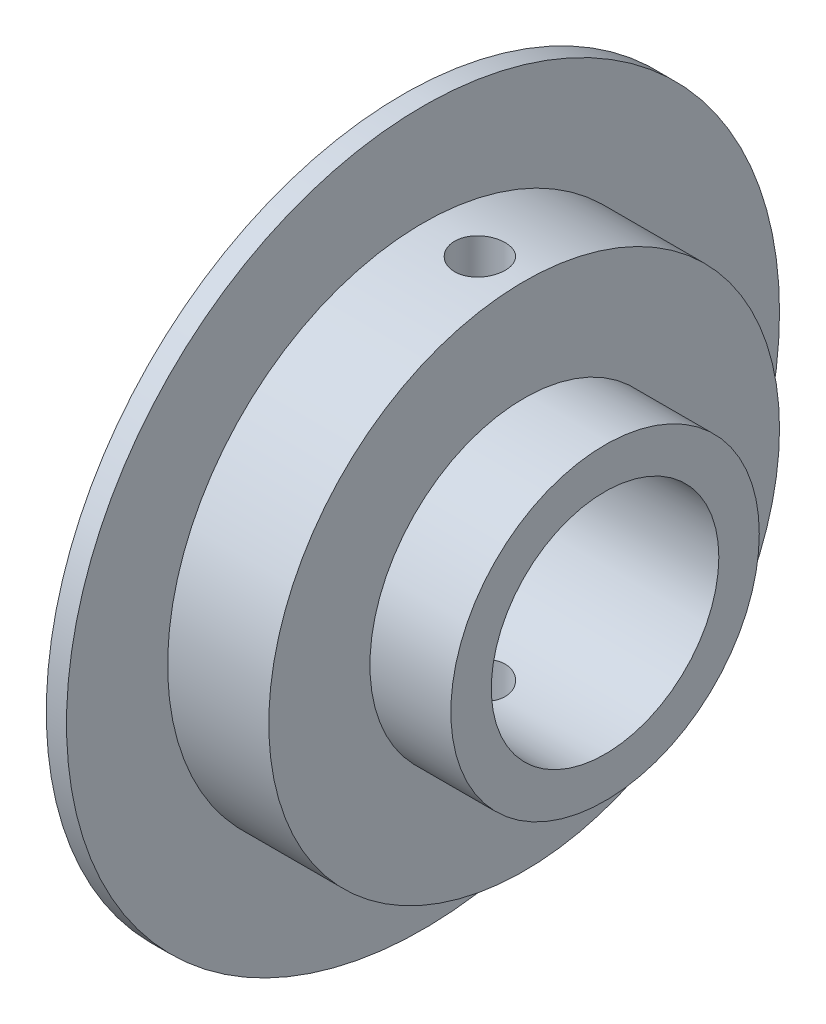
ISO-10303-21;
HEADER;
FILE_DESCRIPTION(('STEP AP214'),'2;1');
FILE_NAME('part.step','',(''),(''),'','','');
FILE_SCHEMA(('AUTOMOTIVE_DESIGN { 1 0 10303 214 1 1 1 1 }'));
ENDSEC;
DATA;
#1=APPLICATION_CONTEXT('core data for automotive mechanical design processes');
#2=APPLICATION_PROTOCOL_DEFINITION('international standard','automotive_design',2000,#1);
#3=PRODUCT_CONTEXT('',#1,'mechanical');
#4=PRODUCT('Part','Part','',(#3));
#5=PRODUCT_RELATED_PRODUCT_CATEGORY('part','',(#4));
#6=PRODUCT_DEFINITION_FORMATION('','',#4);
#7=PRODUCT_DEFINITION_CONTEXT('part definition',#1,'design');
#8=PRODUCT_DEFINITION('design','',#6,#7);
#9=PRODUCT_DEFINITION_SHAPE('','',#8);
#10=(LENGTH_UNIT() NAMED_UNIT(*) SI_UNIT(.MILLI.,.METRE.));
#11=(NAMED_UNIT(*) PLANE_ANGLE_UNIT() SI_UNIT($,.RADIAN.));
#12=(NAMED_UNIT(*) SI_UNIT($,.STERADIAN.) SOLID_ANGLE_UNIT());
#13=UNCERTAINTY_MEASURE_WITH_UNIT(LENGTH_MEASURE(1.E-05),#10,'distance_accuracy_value','');
#14=(GEOMETRIC_REPRESENTATION_CONTEXT(3) GLOBAL_UNCERTAINTY_ASSIGNED_CONTEXT((#13)) GLOBAL_UNIT_ASSIGNED_CONTEXT((#10,
#11,#12)) REPRESENTATION_CONTEXT('',''));
#15=CARTESIAN_POINT('',(0.,0.,0.));
#16=DIRECTION('',(0.,0.,1.));
#17=DIRECTION('',(1.,0.,0.));
#18=AXIS2_PLACEMENT_3D('',#15,#16,#17);
#19=CARTESIAN_POINT('',(0.,9.6,0.));
#20=DIRECTION('',(-1.,0.,0.));
#21=DIRECTION('',(0.,0.,1.));
#22=AXIS2_PLACEMENT_3D('',#19,#20,#21);
#23=PLANE('',#22);
#24=CARTESIAN_POINT('',(0.,-4.5,0.));
#25=DIRECTION('',(1.,0.,0.));
#26=DIRECTION('',(0.,0.,-1.));
#27=AXIS2_PLACEMENT_3D('',#24,#25,#26);
#28=CIRCLE('',#27,4.5);
#29=CARTESIAN_POINT('',(0.,-4.5,-4.5));
#30=VERTEX_POINT('',#29);
#31=EDGE_CURVE('E10',#30,#30,#28,.T.);
#32=ORIENTED_EDGE('',*,*,#31,.T.);
#33=EDGE_LOOP('',(#32));
#34=FACE_BOUND('',#33,.T.);
#35=CARTESIAN_POINT('',(0.,-4.5,0.));
#36=DIRECTION('',(1.,0.,0.));
#37=DIRECTION('',(0.,0.,-1.));
#38=AXIS2_PLACEMENT_3D('',#35,#36,#37);
#39=CIRCLE('',#38,14.1);
#40=CARTESIAN_POINT('',(0.,-4.5,-14.1));
#41=VERTEX_POINT('',#40);
#42=EDGE_CURVE('E121',#41,#41,#39,.T.);
#43=ORIENTED_EDGE('',*,*,#42,.F.);
#44=EDGE_LOOP('',(#43));
#45=FACE_BOUND('',#44,.T.);
#46=ADVANCED_FACE('F37',(#34,#45),#23,.T.);
#47=CARTESIAN_POINT('',(124.631559107303,-4.5,0.));
#48=DIRECTION('',(1.,0.,0.));
#49=DIRECTION('',(0.,0.,-1.));
#50=AXIS2_PLACEMENT_3D('',#47,#48,#49);
#51=CYLINDRICAL_SURFACE('',#50,4.5);
#52=CARTESIAN_POINT('',(3.05,-8.88748219369606,1.));
#53=CARTESIAN_POINT('',(3.10542118384673,-8.88748331342391,0.999998124740785));
#54=CARTESIAN_POINT('',(3.16086470629648,-8.88854372765849,0.995377065735324));
#55=CARTESIAN_POINT('',(3.2701734130143,-8.89266269613714,0.97703611833839));
#56=CARTESIAN_POINT('',(3.324037451702,-8.89572266492455,0.963309788508038));
#57=CARTESIAN_POINT('',(3.42859021114545,-8.90347746164852,0.927213191558881));
#58=CARTESIAN_POINT('',(3.47928240700305,-8.90817046205988,0.904852584002374));
#59=CARTESIAN_POINT('',(3.57619750352572,-8.91866033160417,0.852150017177229));
#60=CARTESIAN_POINT('',(3.6224204658707,-8.92445718549953,0.821808168079243));
#61=CARTESIAN_POINT('',(3.70989128568498,-8.93661451639959,0.753440537295431));
#62=CARTESIAN_POINT('',(3.75104988106007,-8.94298239912488,0.715301848896048));
#63=CARTESIAN_POINT('',(3.82644137621931,-8.95549951724043,0.632666839431873));
#64=CARTESIAN_POINT('',(3.86067372682177,-8.96164873526093,0.588170014707602));
#65=CARTESIAN_POINT('',(3.92159537569772,-8.97311646400736,0.493481972618768));
#66=CARTESIAN_POINT('',(3.94819862472658,-8.97842521703683,0.443234108266534));
#67=CARTESIAN_POINT('',(3.99254990086023,-8.98753012167776,0.338843167825976));
#68=CARTESIAN_POINT('',(4.0102989542355,-8.99132644858096,0.284700544003477));
#69=CARTESIAN_POINT('',(4.03615671646943,-8.99692642233617,0.174985398164166));
#70=CARTESIAN_POINT('',(4.0444165546002,-8.99876127463464,0.11945011413096));
#71=CARTESIAN_POINT('',(4.05153413543621,-9.00033974476021,0.00775382889301148));
#72=CARTESIAN_POINT('',(4.05039298696691,-9.00008360921472,-0.0484070977382728));
#73=CARTESIAN_POINT('',(4.03885313875198,-8.9975327467564,-0.158717960467174));
#74=CARTESIAN_POINT('',(4.02861736045445,-8.99527389802337,-0.212885892163576));
#75=CARTESIAN_POINT('',(3.99943866622242,-8.98901238651153,-0.318715422771708));
#76=CARTESIAN_POINT('',(3.98049534837337,-8.98500964324008,-0.370376905871404));
#77=CARTESIAN_POINT('',(3.93429651294953,-8.97565269302828,-0.470176884695466));
#78=CARTESIAN_POINT('',(3.90697964172778,-8.97028856276396,-0.518286010447011));
#79=CARTESIAN_POINT('',(3.8448549530255,-8.95879635842009,-0.609296568272403));
#80=CARTESIAN_POINT('',(3.81004608446502,-8.9526681771998,-0.652197268314768));
#81=CARTESIAN_POINT('',(3.73303990307352,-8.94016582863413,-0.732542494790414));
#82=CARTESIAN_POINT('',(3.69070001201457,-8.93378920480069,-0.769850109238106));
#83=CARTESIAN_POINT('',(3.60029862619146,-8.92163160720916,-0.836861515102731));
#84=CARTESIAN_POINT('',(3.55223696611286,-8.91585065067021,-0.866565086744066));
#85=CARTESIAN_POINT('',(3.45153005582566,-8.90553216782544,-0.91758882957986));
#86=CARTESIAN_POINT('',(3.39887088859767,-8.9009986024148,-0.93888238720365));
#87=CARTESIAN_POINT('',(3.29059691435886,-8.89374257045182,-0.97227634761584));
#88=CARTESIAN_POINT('',(3.23498259457134,-8.89101980634257,-0.984378260852373));
#89=CARTESIAN_POINT('',(3.12363000647013,-8.88775454247314,-0.998831494501015));
#90=CARTESIAN_POINT('',(3.06791893448007,-8.88716740125429,-1.00138249383898));
#91=CARTESIAN_POINT('',(2.95686753851872,-8.88811932262746,-0.997202737121733));
#92=CARTESIAN_POINT('',(2.90152718847078,-8.88965823406047,-0.990472640937895));
#93=CARTESIAN_POINT('',(2.79348823125171,-8.89464664137563,-0.968095186613481));
#94=CARTESIAN_POINT('',(2.74076551235185,-8.89807241834516,-0.952558463272168));
#95=CARTESIAN_POINT('',(2.63867168443566,-8.90642704252923,-0.913128875693618));
#96=CARTESIAN_POINT('',(2.58930090525027,-8.91135603739913,-0.889235190550063));
#97=CARTESIAN_POINT('',(2.49445019911179,-8.92225937025824,-0.833332350832739));
#98=CARTESIAN_POINT('',(2.44904434250747,-8.92824903821989,-0.801200572354219));
#99=CARTESIAN_POINT('',(2.36419582129565,-8.94055871006593,-0.729893521468861));
#100=CARTESIAN_POINT('',(2.32475392348571,-8.94687875628735,-0.690717344765467));
#101=CARTESIAN_POINT('',(2.2521743282457,-8.95928466963624,-0.605528607307309));
#102=CARTESIAN_POINT('',(2.21917298206527,-8.96536366365756,-0.559398704918137));
#103=CARTESIAN_POINT('',(2.16138793288299,-8.97647455721721,-0.462134081071293));
#104=CARTESIAN_POINT('',(2.13660383968328,-8.98150650647044,-0.41099959740653));
#105=CARTESIAN_POINT('',(2.09614494268329,-8.98992744359791,-0.305500950001647));
#106=CARTESIAN_POINT('',(2.08041140205292,-8.99332700109296,-0.251160194087202));
#107=CARTESIAN_POINT('',(2.05831741999173,-8.99814588349754,-0.140522543397795));
#108=CARTESIAN_POINT('',(2.05195556964307,-8.99956550606412,-0.0842259439625955));
#109=CARTESIAN_POINT('',(2.04885060881552,-9.00025537600146,0.0274324227701897));
#110=CARTESIAN_POINT('',(2.05190418467038,-8.99957105615266,0.0827883528681097));
#111=CARTESIAN_POINT('',(2.06708747527836,-8.99622763231539,0.192177020683066));
#112=CARTESIAN_POINT('',(2.07921701654745,-8.99356856607352,0.246209783671608));
#113=CARTESIAN_POINT('',(2.11210917859742,-8.98657818532304,0.351255142393358));
#114=CARTESIAN_POINT('',(2.13284211195059,-8.98225262496609,0.402277441320411));
#115=CARTESIAN_POINT('',(2.18232390176949,-8.97239043658606,0.500145764046379));
#116=CARTESIAN_POINT('',(2.21107356308923,-8.96685368697546,0.546991367894834));
#117=CARTESIAN_POINT('',(2.27643113873243,-8.95503741308905,0.636165449755516));
#118=CARTESIAN_POINT('',(2.31318151784809,-8.94874549747429,0.678387879198454));
#119=CARTESIAN_POINT('',(2.3932110682228,-8.93619353584561,0.756135866174557));
#120=CARTESIAN_POINT('',(2.43649181788245,-8.92993349791575,0.791659799988316));
#121=CARTESIAN_POINT('',(2.52907724990507,-8.9180568509948,0.855479255716282));
#122=CARTESIAN_POINT('',(2.57845730841477,-8.91245039614391,0.883667429316083));
#123=CARTESIAN_POINT('',(2.68136844773064,-8.902644201522,0.931300131649453));
#124=CARTESIAN_POINT('',(2.73489602206519,-8.8984432890926,0.950751953872793));
#125=CARTESIAN_POINT('',(2.83205323701998,-8.89268810860696,0.976946747324326));
#126=CARTESIAN_POINT('',(2.87516171363364,-8.8907490225869,0.985574910239044));
#127=CARTESIAN_POINT('',(2.96217547829319,-8.88814565456081,0.997102130853923));
#128=CARTESIAN_POINT('',(3.00608072483999,-8.88748130635241,1.00000148607481));
#129=CARTESIAN_POINT('',(3.05,-8.88748219369606,1.));
#130=B_SPLINE_CURVE_WITH_KNOTS('',3,(#52,#53,#54,#55,#56,#57,#58,#59,#60,#61,#62,#63,#64,#65,
#66,#67,#68,#69,#70,#71,#72,#73,#74,#75,#76,#77,#78,#79,#80,#81,#82,#83,#84,#85,#86,#87,#88,#89,
#90,#91,#92,#93,#94,#95,#96,#97,#98,#99,#100,#101,#102,#103,#104,#105,#106,#107,#108,#109,#110,
#111,#112,#113,#114,#115,#116,#117,#118,#119,#120,#121,#122,#123,#124,#125,#126,#127,#128,#129),
.UNSPECIFIED.,.T.,.F.,(4,2,2,2,2,2,2,2,2,2,2,2,2,2,2,2,2,2,2,2,2,2,2,2,2,2,2,2,2,2,2,2,2,2,2,2,
2,2,4),(0.,0.16610255849459,0.332322750192435,0.498357520008392,0.664389998050726,
0.833022969567701,1.00166930675099,1.17214906318353,1.34260905508582,1.51031485736443,
1.67800087939989,1.84274220917405,2.00749114368964,2.17347729000196,2.33948673831992,
2.50906023645939,2.67863863513816,2.84874944722111,3.01883229921634,3.18533874755265,
3.35183335815117,3.51628128972295,3.68074537959259,3.84781614360498,4.01490836999235,
4.18522523018715,4.35553400169376,4.52472464724766,4.6938898544815,4.85942793779578,
5.02496285698629,5.18993125886616,5.35491622901636,5.52312234724343,5.69136918646788,
5.86195485764065,6.03239785047427,6.16403493145229,6.29566517579135),.UNSPECIFIED.);
#131=CARTESIAN_POINT('',(3.05,-8.88748219369606,1.));
#132=VERTEX_POINT('',#131);
#133=EDGE_CURVE('E87',#132,#132,#130,.T.);
#134=ORIENTED_EDGE('',*,*,#133,.F.);
#135=EDGE_LOOP('',(#134));
#136=FACE_BOUND('',#135,.T.);
#137=CARTESIAN_POINT('',(3.05,-0.11251780630394,1.));
#138=CARTESIAN_POINT('',(2.99457881615327,-0.112516686576091,0.999998124740785));
#139=CARTESIAN_POINT('',(2.93913529370352,-0.111456272341509,0.995377065735324));
#140=CARTESIAN_POINT('',(2.8298265869857,-0.107337303862863,0.97703611833839));
#141=CARTESIAN_POINT('',(2.77596254829799,-0.104277335075449,0.963309788508038));
#142=CARTESIAN_POINT('',(2.67140978885454,-0.0965225383514754,0.927213191558881));
#143=CARTESIAN_POINT('',(2.62071759299695,-0.091829537940117,0.904852584002374));
#144=CARTESIAN_POINT('',(2.52380249647428,-0.0813396683958286,0.85215001717723));
#145=CARTESIAN_POINT('',(2.4775795341293,-0.0755428145004641,0.821808168079243));
#146=CARTESIAN_POINT('',(2.39010871431502,-0.0633854836004084,0.753440537295431));
#147=CARTESIAN_POINT('',(2.34895011893993,-0.0570176008751201,0.715301848896049));
#148=CARTESIAN_POINT('',(2.27355862378069,-0.044500482759573,0.632666839431874));
#149=CARTESIAN_POINT('',(2.23932627317823,-0.0383512647390676,0.588170014707603));
#150=CARTESIAN_POINT('',(2.17840462430228,-0.0268835359926352,0.49348197261877));
#151=CARTESIAN_POINT('',(2.15180137527342,-0.0215747829631692,0.443234108266535));
#152=CARTESIAN_POINT('',(2.10745009913977,-0.0124698783222363,0.338843167825977));
#153=CARTESIAN_POINT('',(2.0897010457645,-0.00867355141903606,0.284700544003479));
#154=CARTESIAN_POINT('',(2.06384328353057,-0.00307357766382575,0.174985398164168));
#155=CARTESIAN_POINT('',(2.0555834453998,-0.00123872536536133,0.119450114130962));
#156=CARTESIAN_POINT('',(2.04846586456379,0.000339744760214479,0.00775382889301297));
#157=CARTESIAN_POINT('',(2.04960701303309,8.36092147237012E-05,-0.0484070977382713));
#158=CARTESIAN_POINT('',(2.06114686124802,-0.00246725324360091,-0.158717960467172));
#159=CARTESIAN_POINT('',(2.07138263954555,-0.00472610197662878,-0.212885892163575));
#160=CARTESIAN_POINT('',(2.10056133377758,-0.0109876134884737,-0.318715422771707));
#161=CARTESIAN_POINT('',(2.11950465162663,-0.0149903567599151,-0.370376905871404));
#162=CARTESIAN_POINT('',(2.16570348705047,-0.0243473069717237,-0.470176884695465));
#163=CARTESIAN_POINT('',(2.19302035827222,-0.0297114372360362,-0.51828601044701));
#164=CARTESIAN_POINT('',(2.2551450469745,-0.0412036415799141,-0.609296568272403));
#165=CARTESIAN_POINT('',(2.28995391553498,-0.0473318228002018,-0.652197268314768));
#166=CARTESIAN_POINT('',(2.36696009692648,-0.0598341713658731,-0.732542494790414));
#167=CARTESIAN_POINT('',(2.40929998798542,-0.0662107951993092,-0.769850109238106));
#168=CARTESIAN_POINT('',(2.49970137380854,-0.0783683927908374,-0.836861515102731));
#169=CARTESIAN_POINT('',(2.54776303388714,-0.0841493493297904,-0.866565086744066));
#170=CARTESIAN_POINT('',(2.64846994417434,-0.0944678321745574,-0.91758882957986));
#171=CARTESIAN_POINT('',(2.70112911140233,-0.0990013975851999,-0.93888238720365));
#172=CARTESIAN_POINT('',(2.80940308564114,-0.10625742954818,-0.972276347615841));
#173=CARTESIAN_POINT('',(2.86501740542866,-0.108980193657431,-0.984378260852373));
#174=CARTESIAN_POINT('',(2.97636999352986,-0.112245457526858,-0.998831494501015));
#175=CARTESIAN_POINT('',(3.03208106551993,-0.112832598745706,-1.00138249383898));
#176=CARTESIAN_POINT('',(3.14313246148128,-0.111880677372541,-0.997202737121733));
#177=CARTESIAN_POINT('',(3.19847281152922,-0.110341765939535,-0.990472640937895));
#178=CARTESIAN_POINT('',(3.30651176874829,-0.105353358624371,-0.968095186613481));
#179=CARTESIAN_POINT('',(3.35923448764814,-0.101927581654842,-0.952558463272168));
#180=CARTESIAN_POINT('',(3.46132831556434,-0.0935729574707667,-0.913128875693619));
#181=CARTESIAN_POINT('',(3.51069909474973,-0.088643962600866,-0.889235190550064));
#182=CARTESIAN_POINT('',(3.60554980088821,-0.0777406297417656,-0.83333235083274));
#183=CARTESIAN_POINT('',(3.65095565749253,-0.0717509617801117,-0.801200572354219));
#184=CARTESIAN_POINT('',(3.73580417870434,-0.0594412899340664,-0.729893521468862));
#185=CARTESIAN_POINT('',(3.77524607651429,-0.0531212437126493,-0.690717344765468));
#186=CARTESIAN_POINT('',(3.84782567175429,-0.0407153303637576,-0.60552860730731));
#187=CARTESIAN_POINT('',(3.88082701793473,-0.0346363363424369,-0.559398704918138));
#188=CARTESIAN_POINT('',(3.93861206711701,-0.0235254427827869,-0.462134081071295));
#189=CARTESIAN_POINT('',(3.96339616031672,-0.0184934935295583,-0.410999597406532));
#190=CARTESIAN_POINT('',(4.0038550573167,-0.010072556402087,-0.305500950001649));
#191=CARTESIAN_POINT('',(4.01958859794708,-0.00667299890703729,-0.251160194087204));
#192=CARTESIAN_POINT('',(4.04168258000827,-0.00185411650245542,-0.140522543397797));
#193=CARTESIAN_POINT('',(4.04804443035693,-0.000434493935876402,-0.0842259439625973));
#194=CARTESIAN_POINT('',(4.05114939118447,0.00025537600145575,0.0274324227701877));
#195=CARTESIAN_POINT('',(4.04809581532961,-0.000428943847339516,0.0827883528681077));
#196=CARTESIAN_POINT('',(4.03291252472164,-0.00377236768461413,0.192177020683065));
#197=CARTESIAN_POINT('',(4.02078298345254,-0.00643143392647532,0.246209783671607));
#198=CARTESIAN_POINT('',(3.98789082140258,-0.0134218146769626,0.351255142393358));
#199=CARTESIAN_POINT('',(3.96715788804941,-0.017747375033912,0.40227744132041));
#200=CARTESIAN_POINT('',(3.91767609823051,-0.0276095634139414,0.500145764046378));
#201=CARTESIAN_POINT('',(3.88892643691077,-0.0331463130245405,0.546991367894833));
#202=CARTESIAN_POINT('',(3.82356886126757,-0.0449625869109492,0.636165449755516));
#203=CARTESIAN_POINT('',(3.78681848215191,-0.0512545025257131,0.678387879198454));
#204=CARTESIAN_POINT('',(3.70678893177719,-0.0638064641543937,0.756135866174557));
#205=CARTESIAN_POINT('',(3.66350818211755,-0.0700665020842495,0.791659799988316));
#206=CARTESIAN_POINT('',(3.57092275009492,-0.0819431490052026,0.855479255716282));
#207=CARTESIAN_POINT('',(3.52154269158522,-0.0875496038560867,0.883667429316083));
#208=CARTESIAN_POINT('',(3.41863155226936,-0.0973557984779971,0.931300131649453));
#209=CARTESIAN_POINT('',(3.3651039779348,-0.1015567109074,0.950751953872793));
#210=CARTESIAN_POINT('',(3.26794676298002,-0.107311891393037,0.976946747324326));
#211=CARTESIAN_POINT('',(3.22483828636636,-0.109250977413098,0.985574910239044));
#212=CARTESIAN_POINT('',(3.13782452170681,-0.111854345439191,0.997102130853924));
#213=CARTESIAN_POINT('',(3.09391927516001,-0.112518693647589,1.00000148607481));
#214=CARTESIAN_POINT('',(3.05,-0.11251780630394,1.));
#215=B_SPLINE_CURVE_WITH_KNOTS('',3,(#137,#138,#139,#140,#141,#142,#143,#144,#145,#146,#147,
#148,#149,#150,#151,#152,#153,#154,#155,#156,#157,#158,#159,#160,#161,#162,#163,#164,#165,#166,
#167,#168,#169,#170,#171,#172,#173,#174,#175,#176,#177,#178,#179,#180,#181,#182,#183,#184,#185,
#186,#187,#188,#189,#190,#191,#192,#193,#194,#195,#196,#197,#198,#199,#200,#201,#202,#203,#204,
#205,#206,#207,#208,#209,#210,#211,#212,#213,#214),.UNSPECIFIED.,.T.,.F.,(4,2,2,2,2,2,2,2,2,2,2,
2,2,2,2,2,2,2,2,2,2,2,2,2,2,2,2,2,2,2,2,2,2,2,2,2,2,2,4),(0.,0.16610255849459,0.332322750192434,
0.498357520008392,0.664389998050725,0.8330229695677,1.00166930675099,1.17214906318353,
1.34260905508582,1.51031485736443,1.67800087939989,1.84274220917405,2.00749114368964,
2.17347729000196,2.33948673831992,2.50906023645939,2.67863863513816,2.84874944722111,
3.01883229921634,3.18533874755265,3.35183335815117,3.51628128972295,3.68074537959259,
3.84781614360498,4.01490836999235,4.18522523018715,4.35553400169375,4.52472464724766,
4.6938898544815,4.85942793779578,5.02496285698629,5.18993125886616,5.35491622901636,
5.52312234724343,5.69136918646788,5.86195485764065,6.03239785047427,6.16403493145229,
6.29566517579135),.UNSPECIFIED.);
#216=CARTESIAN_POINT('',(3.05,-0.11251780630394,1.));
#217=VERTEX_POINT('',#216);
#218=EDGE_CURVE('E81',#217,#217,#215,.T.);
#219=ORIENTED_EDGE('',*,*,#218,.F.);
#220=EDGE_LOOP('',(#219));
#221=FACE_BOUND('',#220,.T.);
#222=CARTESIAN_POINT('',(7.99999999999999,-4.5,0.));
#223=DIRECTION('',(1.,0.,0.));
#224=DIRECTION('',(0.,0.,-1.));
#225=AXIS2_PLACEMENT_3D('',#222,#223,#224);
#226=CIRCLE('',#225,4.5);
#227=CARTESIAN_POINT('',(7.99999999999999,-4.5,-4.5));
#228=VERTEX_POINT('',#227);
#229=EDGE_CURVE('E50',#228,#228,#226,.T.);
#230=ORIENTED_EDGE('',*,*,#229,.T.);
#231=EDGE_LOOP('',(#230));
#232=FACE_BOUND('',#231,.T.);
#233=ORIENTED_EDGE('',*,*,#31,.F.);
#234=EDGE_LOOP('',(#233));
#235=FACE_BOUND('',#234,.T.);
#236=ADVANCED_FACE('F92',(#136,#221,#232,#235),#51,.F.);
#237=CARTESIAN_POINT('',(8.,0.,0.));
#238=DIRECTION('',(1.,0.,0.));
#239=DIRECTION('',(0.,0.,-1.));
#240=AXIS2_PLACEMENT_3D('',#237,#238,#239);
#241=PLANE('',#240);
#242=CARTESIAN_POINT('',(7.99999999999999,-4.5,0.));
#243=DIRECTION('',(1.,0.,0.));
#244=DIRECTION('',(0.,0.,-1.));
#245=AXIS2_PLACEMENT_3D('',#242,#243,#244);
#246=CIRCLE('',#245,6.1);
#247=CARTESIAN_POINT('',(7.99999999999999,-4.5,-6.1));
#248=VERTEX_POINT('',#247);
#249=EDGE_CURVE('E56',#248,#248,#246,.T.);
#250=ORIENTED_EDGE('',*,*,#249,.T.);
#251=EDGE_LOOP('',(#250));
#252=FACE_BOUND('',#251,.T.);
#253=ORIENTED_EDGE('',*,*,#229,.F.);
#254=EDGE_LOOP('',(#253));
#255=FACE_BOUND('',#254,.T.);
#256=ADVANCED_FACE('F96',(#252,#255),#241,.T.);
#257=CARTESIAN_POINT('',(124.631559107303,-4.5,0.));
#258=DIRECTION('',(1.,0.,0.));
#259=DIRECTION('',(0.,0.,-1.));
#260=AXIS2_PLACEMENT_3D('',#257,#258,#259);
#261=CYLINDRICAL_SURFACE('',#260,6.1);
#262=CARTESIAN_POINT('',(4.8,-4.5,0.));
#263=DIRECTION('',(1.,0.,0.));
#264=DIRECTION('',(0.,0.,-1.));
#265=AXIS2_PLACEMENT_3D('',#262,#263,#264);
#266=CIRCLE('',#265,6.1);
#267=CARTESIAN_POINT('',(4.8,-4.5,-6.1));
#268=VERTEX_POINT('',#267);
#269=EDGE_CURVE('E138',#268,#268,#266,.T.);
#270=ORIENTED_EDGE('',*,*,#269,.T.);
#271=EDGE_LOOP('',(#270));
#272=FACE_BOUND('',#271,.T.);
#273=ORIENTED_EDGE('',*,*,#249,.F.);
#274=EDGE_LOOP('',(#273));
#275=FACE_BOUND('',#274,.T.);
#276=ADVANCED_FACE('F101',(#272,#275),#261,.T.);
#277=CARTESIAN_POINT('',(4.8,1.6,0.));
#278=DIRECTION('',(1.,0.,0.));
#279=DIRECTION('',(0.,0.,-1.));
#280=AXIS2_PLACEMENT_3D('',#277,#278,#279);
#281=PLANE('',#280);
#282=CARTESIAN_POINT('',(4.8,-4.5,0.));
#283=DIRECTION('',(1.,0.,0.));
#284=DIRECTION('',(0.,0.,-1.));
#285=AXIS2_PLACEMENT_3D('',#282,#283,#284);
#286=CIRCLE('',#285,10.1);
#287=CARTESIAN_POINT('',(4.8,-4.5,-10.1));
#288=VERTEX_POINT('',#287);
#289=EDGE_CURVE('E135',#288,#288,#286,.T.);
#290=ORIENTED_EDGE('',*,*,#289,.T.);
#291=EDGE_LOOP('',(#290));
#292=FACE_BOUND('',#291,.T.);
#293=ORIENTED_EDGE('',*,*,#269,.F.);
#294=EDGE_LOOP('',(#293));
#295=FACE_BOUND('',#294,.T.);
#296=ADVANCED_FACE('F104',(#292,#295),#281,.T.);
#297=CARTESIAN_POINT('',(124.631559107303,-4.5,0.));
#298=DIRECTION('',(1.,0.,0.));
#299=DIRECTION('',(0.,0.,-1.));
#300=AXIS2_PLACEMENT_3D('',#297,#298,#299);
#301=CYLINDRICAL_SURFACE('',#300,10.1);
#302=CARTESIAN_POINT('',(3.05,-14.5503731274018,1.));
#303=CARTESIAN_POINT('',(2.99397745898303,-14.5503737782474,0.999997571858827));
#304=CARTESIAN_POINT('',(2.93791780508846,-14.5508465944964,0.995276358096216));
#305=CARTESIAN_POINT('',(2.8273525672047,-14.5526865262194,0.976513713734305));
#306=CARTESIAN_POINT('',(2.77284876834701,-14.5540546290154,0.962461993200321));
#307=CARTESIAN_POINT('',(2.66701241575861,-14.5575286815063,0.925451338062829));
#308=CARTESIAN_POINT('',(2.6156779691637,-14.5596341856819,0.902497780829834));
#309=CARTESIAN_POINT('',(2.5176015367867,-14.5643452546663,0.84834529787834));
#310=CARTESIAN_POINT('',(2.47085863696066,-14.5669507196413,0.817148017827857));
#311=CARTESIAN_POINT('',(2.38311423077585,-14.5723785535364,0.747274053095841));
#312=CARTESIAN_POINT('',(2.34213140494768,-14.5752015842118,0.708573959418187));
#313=CARTESIAN_POINT('',(2.26723133177102,-14.5807404541301,0.624842910630738));
#314=CARTESIAN_POINT('',(2.23331440674817,-14.5834562884783,0.579811666869348));
#315=CARTESIAN_POINT('',(2.17344450528099,-14.5884812824287,0.484582353537081));
#316=CARTESIAN_POINT('',(2.14750803706618,-14.5907895948926,0.43437385687088));
#317=CARTESIAN_POINT('',(2.10444090231188,-14.5947322641884,0.330287687436852));
#318=CARTESIAN_POINT('',(2.08731002503748,-14.596366637149,0.276410102512387));
#319=CARTESIAN_POINT('',(2.06239507526336,-14.5987726345726,0.16670369641122));
#320=CARTESIAN_POINT('',(2.05458035405734,-14.5995470874591,0.110881898744157));
#321=CARTESIAN_POINT('',(2.04842472083451,-14.6001556017131,-0.00128596314544956));
#322=CARTESIAN_POINT('',(2.05008356765147,-14.5999896870192,-0.0576320139857563));
#323=CARTESIAN_POINT('',(2.06280308977107,-14.5987384766243,-0.169040881188802));
#324=CARTESIAN_POINT('',(2.07383080811418,-14.5976564037463,-0.224107501487652));
#325=CARTESIAN_POINT('',(2.1049237005999,-14.5946981949182,-0.331604440274131));
#326=CARTESIAN_POINT('',(2.12498899015157,-14.592822048828,-0.38403472508646));
#327=CARTESIAN_POINT('',(2.17362361923391,-14.5884810939114,-0.484874636397215));
#328=CARTESIAN_POINT('',(2.20220755406236,-14.5860152762241,-0.533277178460569));
#329=CARTESIAN_POINT('',(2.26705748240296,-14.5807716895479,-0.624610328474633));
#330=CARTESIAN_POINT('',(2.30332369674888,-14.5779939115924,-0.667540779068495));
#331=CARTESIAN_POINT('',(2.38269409452907,-14.5724240912715,-0.746904119177743));
#332=CARTESIAN_POINT('',(2.42582694525576,-14.5696320388339,-0.783308344215424));
#333=CARTESIAN_POINT('',(2.51760680631428,-14.5643602500764,-0.848363961424643));
#334=CARTESIAN_POINT('',(2.56625382438853,-14.5618805141949,-0.877015342710246));
#335=CARTESIAN_POINT('',(2.66770301640802,-14.5575138791461,-0.925751765509069));
#336=CARTESIAN_POINT('',(2.72050603786529,-14.5556271012913,-0.945835054387004));
#337=CARTESIAN_POINT('',(2.82875755020088,-14.5526624977888,-0.97684261089733));
#338=CARTESIAN_POINT('',(2.88420596205203,-14.5515846479915,-0.987767151953082));
#339=CARTESIAN_POINT('',(2.99592268700618,-14.5503640970664,-1.00011027019085));
#340=CARTESIAN_POINT('',(3.05218652903106,-14.5502174518162,-1.00156894070119));
#341=CARTESIAN_POINT('',(3.16415785154686,-14.5508655046005,-0.995044187851684));
#342=CARTESIAN_POINT('',(3.21986533939473,-14.5516601901707,-0.987060889514837));
#343=CARTESIAN_POINT('',(3.32902586907003,-14.554097773971,-0.961912351875899));
#344=CARTESIAN_POINT('',(3.38248331715019,-14.5557389221439,-0.944766054397921));
#345=CARTESIAN_POINT('',(3.48576324131785,-14.5596830912884,-0.901797571749343));
#346=CARTESIAN_POINT('',(3.53558563570152,-14.5619861271312,-0.875975191642545));
#347=CARTESIAN_POINT('',(3.6303639703132,-14.5670041236245,-0.816287043459562));
#348=CARTESIAN_POINT('',(3.67530310020927,-14.569720434456,-0.782394697659195));
#349=CARTESIAN_POINT('',(3.75886881714373,-14.5752544900032,-0.707566810217285));
#350=CARTESIAN_POINT('',(3.79749525092914,-14.5780722371794,-0.666631097633821));
#351=CARTESIAN_POINT('',(3.86747728382823,-14.5835035691449,-0.5787046015321));
#352=CARTESIAN_POINT('',(3.89880673463493,-14.5861163981014,-0.53169295299041));
#353=CARTESIAN_POINT('',(3.95312557139725,-14.5908324992433,-0.433052192156358));
#354=CARTESIAN_POINT('',(3.97611506966915,-14.5929357782907,-0.381423142059406));
#355=CARTESIAN_POINT('',(4.01305706992038,-14.5963923774455,-0.275104570273095));
#356=CARTESIAN_POINT('',(4.02702538952555,-14.5977470096159,-0.220420589048202));
#357=CARTESIAN_POINT('',(4.04558015035507,-14.5995590636255,-0.109469368426977));
#358=CARTESIAN_POINT('',(4.05016684969064,-14.6000165101483,-0.0532021726319129));
#359=CARTESIAN_POINT('',(4.0498245819759,-14.5999826414629,0.0590613596165408));
#360=CARTESIAN_POINT('',(4.04493621789925,-14.5994953745812,0.115057825512922));
#361=CARTESIAN_POINT('',(4.02586769731298,-14.5976348193931,0.225429953686843));
#362=CARTESIAN_POINT('',(4.01168753311968,-14.5962615303539,0.279805614624051));
#363=CARTESIAN_POINT('',(3.97444912491817,-14.5927828128581,0.385392481602478));
#364=CARTESIAN_POINT('',(3.95139203981863,-14.5906774799754,0.436604099706612));
#365=CARTESIAN_POINT('',(3.89705864402027,-14.5859694117964,0.534436685318623));
#366=CARTESIAN_POINT('',(3.86578238663892,-14.5833666797267,0.581057682602999));
#367=CARTESIAN_POINT('',(3.79574619037453,-14.5779420948585,0.668593691516998));
#368=CARTESIAN_POINT('',(3.75695602799574,-14.5751193856067,0.709484469170345));
#369=CARTESIAN_POINT('',(3.67305245870782,-14.5695802293522,0.784194688235218));
#370=CARTESIAN_POINT('',(3.62793753574043,-14.5668638080273,0.81801242936782));
#371=CARTESIAN_POINT('',(3.53254207138734,-14.5618375159984,0.877683011608633));
#372=CARTESIAN_POINT('',(3.48224890213427,-14.5595286782905,0.903515736038437));
#373=CARTESIAN_POINT('',(3.3780481063763,-14.5555912951437,0.946335195948447));
#374=CARTESIAN_POINT('',(3.32414463995927,-14.5539619818345,0.96333192159081));
#375=CARTESIAN_POINT('',(3.23327927957775,-14.551979537798,0.983752620646258));
#376=CARTESIAN_POINT('',(3.19689853422813,-14.5513799775876,0.989837075812403));
#377=CARTESIAN_POINT('',(3.12368387712395,-14.550576559146,0.997961555790466));
#378=CARTESIAN_POINT('',(3.08684996722516,-14.5503726992948,1.0000015971593));
#379=CARTESIAN_POINT('',(3.05,-14.5503731274018,1.));
#380=B_SPLINE_CURVE_WITH_KNOTS('',3,(#302,#303,#304,#305,#306,#307,#308,#309,#310,#311,#312,
#313,#314,#315,#316,#317,#318,#319,#320,#321,#322,#323,#324,#325,#326,#327,#328,#329,#330,#331,
#332,#333,#334,#335,#336,#337,#338,#339,#340,#341,#342,#343,#344,#345,#346,#347,#348,#349,#350,
#351,#352,#353,#354,#355,#356,#357,#358,#359,#360,#361,#362,#363,#364,#365,#366,#367,#368,#369,
#370,#371,#372,#373,#374,#375,#376,#377,#378,#379),.UNSPECIFIED.,.T.,.F.,(4,2,2,2,2,2,2,2,2,2,2,
2,2,2,2,2,2,2,2,2,2,2,2,2,2,2,2,2,2,2,2,2,2,2,2,2,2,2,4),(0.,0.16793305491794,0.336051619217539,
0.50406878520752,0.672052435773684,0.840568889384629,1.0090930285386,1.1779634657313,
1.34682986133804,1.51513916598234,1.68344418603832,1.85115959787557,2.01887715148612,
2.1868837299259,2.35489513851598,2.52362731224071,2.69235972288472,2.8611266318437,
3.02988850229091,3.19793510139241,3.36597947538002,3.53367780291601,3.70137989858819,
3.86964213785012,4.03790846139866,4.20676878604711,4.3756268365256,4.54418800369012,
4.71274453326415,4.88058035339139,5.04841631230733,5.21623036716113,5.38404333343794,
5.55254586903987,5.72108886433008,5.89005307346012,6.05882583041548,6.16928766936792,
6.27974905611353),.UNSPECIFIED.);
#381=CARTESIAN_POINT('',(3.05,-14.5503731274018,1.));
#382=VERTEX_POINT('',#381);
#383=EDGE_CURVE('E40',#382,#382,#380,.T.);
#384=ORIENTED_EDGE('',*,*,#383,.F.);
#385=EDGE_LOOP('',(#384));
#386=FACE_BOUND('',#385,.T.);
#387=CARTESIAN_POINT('',(3.05,5.55037312740179,1.));
#388=CARTESIAN_POINT('',(3.10602254101697,5.5503737782474,0.999997571858827));
#389=CARTESIAN_POINT('',(3.16208219491154,5.55084659449643,0.995276358096216));
#390=CARTESIAN_POINT('',(3.2726474327953,5.5526865262194,0.976513713734305));
#391=CARTESIAN_POINT('',(3.32715123165298,5.55405462901535,0.962461993200321));
#392=CARTESIAN_POINT('',(3.43298758424139,5.55752868150635,0.925451338062829));
#393=CARTESIAN_POINT('',(3.4843220308363,5.55963418568189,0.902497780829834));
#394=CARTESIAN_POINT('',(3.5823984632133,5.56434525466633,0.848345297878341));
#395=CARTESIAN_POINT('',(3.62914136303933,5.56695071964125,0.817148017827858));
#396=CARTESIAN_POINT('',(3.71688576922414,5.5723785535364,0.747274053095842));
#397=CARTESIAN_POINT('',(3.75786859505232,5.57520158421182,0.708573959418188));
#398=CARTESIAN_POINT('',(3.83276866822898,5.58074045413006,0.624842910630739));
#399=CARTESIAN_POINT('',(3.86668559325183,5.58345628847832,0.57981166686935));
#400=CARTESIAN_POINT('',(3.92655549471901,5.58848128242875,0.484582353537082));
#401=CARTESIAN_POINT('',(3.95249196293382,5.59078959489256,0.434373856870881));
#402=CARTESIAN_POINT('',(3.99555909768812,5.59473226418844,0.330287687436853));
#403=CARTESIAN_POINT('',(4.01268997496252,5.596366637149,0.276410102512388));
#404=CARTESIAN_POINT('',(4.03760492473664,5.59877263457264,0.166703696411221));
#405=CARTESIAN_POINT('',(4.04541964594266,5.59954708745912,0.110881898744158));
#406=CARTESIAN_POINT('',(4.05157527916549,5.60015560171305,-0.00128596314544885));
#407=CARTESIAN_POINT('',(4.04991643234852,5.5999896870192,-0.0576320139857557));
#408=CARTESIAN_POINT('',(4.03719691022893,5.59873847662428,-0.169040881188802));
#409=CARTESIAN_POINT('',(4.02616919188582,5.59765640374627,-0.224107501487652));
#410=CARTESIAN_POINT('',(3.9950762994001,5.59469819491822,-0.331604440274131));
#411=CARTESIAN_POINT('',(3.97501100984842,5.59282204882795,-0.38403472508646));
#412=CARTESIAN_POINT('',(3.92637638076609,5.58848109391139,-0.484874636397215));
#413=CARTESIAN_POINT('',(3.89779244593763,5.58601527622414,-0.533277178460569));
#414=CARTESIAN_POINT('',(3.83294251759704,5.5807716895479,-0.624610328474633));
#415=CARTESIAN_POINT('',(3.79667630325112,5.57799391159243,-0.667540779068494));
#416=CARTESIAN_POINT('',(3.71730590547093,5.57242409127147,-0.746904119177743));
#417=CARTESIAN_POINT('',(3.67417305474424,5.56963203883395,-0.783308344215424));
#418=CARTESIAN_POINT('',(3.58239319368572,5.56436025007639,-0.848363961424643));
#419=CARTESIAN_POINT('',(3.53374617561146,5.56188051419488,-0.877015342710246));
#420=CARTESIAN_POINT('',(3.43229698359198,5.55751387914607,-0.925751765509069));
#421=CARTESIAN_POINT('',(3.37949396213471,5.55562710129131,-0.945835054387004));
#422=CARTESIAN_POINT('',(3.27124244979912,5.55266249778875,-0.97684261089733));
#423=CARTESIAN_POINT('',(3.21579403794797,5.55158464799149,-0.987767151953082));
#424=CARTESIAN_POINT('',(3.10407731299382,5.55036409706642,-1.00011027019085));
#425=CARTESIAN_POINT('',(3.04781347096894,5.55021745181622,-1.00156894070119));
#426=CARTESIAN_POINT('',(2.93584214845313,5.55086550460052,-0.995044187851684));
#427=CARTESIAN_POINT('',(2.88013466060527,5.55166019017067,-0.987060889514838));
#428=CARTESIAN_POINT('',(2.77097413092997,5.554097773971,-0.961912351875899));
#429=CARTESIAN_POINT('',(2.71751668284981,5.55573892214395,-0.944766054397921));
#430=CARTESIAN_POINT('',(2.61423675868215,5.55968309128842,-0.901797571749344));
#431=CARTESIAN_POINT('',(2.56441436429848,5.56198612713122,-0.875975191642546));
#432=CARTESIAN_POINT('',(2.4696360296868,5.56700412362447,-0.816287043459563));
#433=CARTESIAN_POINT('',(2.42469689979073,5.56972043445597,-0.782394697659196));
#434=CARTESIAN_POINT('',(2.34113118285627,5.57525449000317,-0.707566810217285));
#435=CARTESIAN_POINT('',(2.30250474907086,5.57807223717939,-0.666631097633821));
#436=CARTESIAN_POINT('',(2.23252271617177,5.58350356914493,-0.578704601532102));
#437=CARTESIAN_POINT('',(2.20119326536506,5.58611639810142,-0.531692952990412));
#438=CARTESIAN_POINT('',(2.14687442860275,5.59083249924326,-0.43305219215636));
#439=CARTESIAN_POINT('',(2.12388493033085,5.59293577829073,-0.381423142059408));
#440=CARTESIAN_POINT('',(2.08694293007961,5.59639237744546,-0.275104570273097));
#441=CARTESIAN_POINT('',(2.07297461047444,5.59774700961593,-0.220420589048203));
#442=CARTESIAN_POINT('',(2.05441984964492,5.59955906362546,-0.109469368426979));
#443=CARTESIAN_POINT('',(2.04983315030936,5.60001651014826,-0.0532021726319139));
#444=CARTESIAN_POINT('',(2.0501754180241,5.59998264146286,0.0590613596165399));
#445=CARTESIAN_POINT('',(2.05506378210075,5.59949537458124,0.115057825512921));
#446=CARTESIAN_POINT('',(2.07413230268702,5.59763481939313,0.225429953686842));
#447=CARTESIAN_POINT('',(2.08831246688032,5.59626153035395,0.27980561462405));
#448=CARTESIAN_POINT('',(2.12555087508183,5.59278281285806,0.385392481602477));
#449=CARTESIAN_POINT('',(2.14860796018137,5.59067747997535,0.436604099706611));
#450=CARTESIAN_POINT('',(2.20294135597973,5.58596941179636,0.534436685318622));
#451=CARTESIAN_POINT('',(2.23421761336108,5.58336667972673,0.581057682602998));
#452=CARTESIAN_POINT('',(2.30425380962547,5.57794209485855,0.668593691516997));
#453=CARTESIAN_POINT('',(2.34304397200426,5.5751193856067,0.709484469170344));
#454=CARTESIAN_POINT('',(2.42694754129218,5.56958022935221,0.784194688235218));
#455=CARTESIAN_POINT('',(2.47206246425956,5.5668638080273,0.818012429367819));
#456=CARTESIAN_POINT('',(2.56745792861265,5.56183751599839,0.877683011608633));
#457=CARTESIAN_POINT('',(2.61775109786573,5.55952867829051,0.903515736038437));
#458=CARTESIAN_POINT('',(2.72195189362369,5.55559129514365,0.946335195948447));
#459=CARTESIAN_POINT('',(2.77585536004072,5.55396198183453,0.963331921590809));
#460=CARTESIAN_POINT('',(2.86672072042225,5.55197953779801,0.983752620646257));
#461=CARTESIAN_POINT('',(2.90310146577187,5.5513799775876,0.989837075812403));
#462=CARTESIAN_POINT('',(2.97631612287605,5.55057655914596,0.997961555790466));
#463=CARTESIAN_POINT('',(3.01315003277484,5.55037269929483,1.0000015971593));
#464=CARTESIAN_POINT('',(3.05,5.55037312740179,1.));
#465=B_SPLINE_CURVE_WITH_KNOTS('',3,(#387,#388,#389,#390,#391,#392,#393,#394,#395,#396,#397,
#398,#399,#400,#401,#402,#403,#404,#405,#406,#407,#408,#409,#410,#411,#412,#413,#414,#415,#416,
#417,#418,#419,#420,#421,#422,#423,#424,#425,#426,#427,#428,#429,#430,#431,#432,#433,#434,#435,
#436,#437,#438,#439,#440,#441,#442,#443,#444,#445,#446,#447,#448,#449,#450,#451,#452,#453,#454,
#455,#456,#457,#458,#459,#460,#461,#462,#463,#464),.UNSPECIFIED.,.T.,.F.,(4,2,2,2,2,2,2,2,2,2,2,
2,2,2,2,2,2,2,2,2,2,2,2,2,2,2,2,2,2,2,2,2,2,2,2,2,2,2,4),(0.,0.16793305491794,0.336051619217539,
0.504068785207519,0.672052435773683,0.840568889384628,1.0090930285386,1.1779634657313,
1.34682986133804,1.51513916598234,1.68344418603832,1.85115959787557,2.01887715148612,
2.1868837299259,2.35489513851598,2.52362731224071,2.69235972288472,2.8611266318437,
3.02988850229091,3.19793510139241,3.36597947538002,3.53367780291601,3.70137989858819,
3.86964213785012,4.03790846139866,4.20676878604711,4.3756268365256,4.54418800369012,
4.71274453326415,4.88058035339139,5.04841631230732,5.21623036716112,5.38404333343794,
5.55254586903987,5.72108886433007,5.89005307346012,6.05882583041548,6.16928766936792,
6.27974905611353),.UNSPECIFIED.);
#466=CARTESIAN_POINT('',(3.05,5.55037312740179,1.));
#467=VERTEX_POINT('',#466);
#468=EDGE_CURVE('E59',#467,#467,#465,.T.);
#469=ORIENTED_EDGE('',*,*,#468,.F.);
#470=EDGE_LOOP('',(#469));
#471=FACE_BOUND('',#470,.T.);
#472=CARTESIAN_POINT('',(0.799999999999995,-4.5,0.));
#473=DIRECTION('',(1.,0.,0.));
#474=DIRECTION('',(0.,0.,-1.));
#475=AXIS2_PLACEMENT_3D('',#472,#473,#474);
#476=CIRCLE('',#475,10.1);
#477=CARTESIAN_POINT('',(0.799999999999995,-4.5,-10.1));
#478=VERTEX_POINT('',#477);
#479=EDGE_CURVE('E128',#478,#478,#476,.T.);
#480=ORIENTED_EDGE('',*,*,#479,.T.);
#481=EDGE_LOOP('',(#480));
#482=FACE_BOUND('',#481,.T.);
#483=ORIENTED_EDGE('',*,*,#289,.F.);
#484=EDGE_LOOP('',(#483));
#485=FACE_BOUND('',#484,.T.);
#486=ADVANCED_FACE('F65',(#386,#471,#482,#485),#301,.T.);
#487=CARTESIAN_POINT('',(0.8,5.6,0.));
#488=DIRECTION('',(1.,0.,0.));
#489=DIRECTION('',(0.,0.,-1.));
#490=AXIS2_PLACEMENT_3D('',#487,#488,#489);
#491=PLANE('',#490);
#492=CARTESIAN_POINT('',(0.799999999999995,-4.5,0.));
#493=DIRECTION('',(1.,0.,0.));
#494=DIRECTION('',(0.,0.,-1.));
#495=AXIS2_PLACEMENT_3D('',#492,#493,#494);
#496=CIRCLE('',#495,14.1);
#497=CARTESIAN_POINT('',(0.799999999999995,-4.5,-14.1));
#498=VERTEX_POINT('',#497);
#499=EDGE_CURVE('E124',#498,#498,#496,.T.);
#500=ORIENTED_EDGE('',*,*,#499,.T.);
#501=EDGE_LOOP('',(#500));
#502=FACE_BOUND('',#501,.T.);
#503=ORIENTED_EDGE('',*,*,#479,.F.);
#504=EDGE_LOOP('',(#503));
#505=FACE_BOUND('',#504,.T.);
#506=ADVANCED_FACE('F111',(#502,#505),#491,.T.);
#507=CARTESIAN_POINT('',(124.631559107303,-4.5,0.));
#508=DIRECTION('',(1.,0.,0.));
#509=DIRECTION('',(0.,0.,-1.));
#510=AXIS2_PLACEMENT_3D('',#507,#508,#509);
#511=CYLINDRICAL_SURFACE('',#510,14.1);
#512=ORIENTED_EDGE('',*,*,#42,.T.);
#513=EDGE_LOOP('',(#512));
#514=FACE_BOUND('',#513,.T.);
#515=ORIENTED_EDGE('',*,*,#499,.F.);
#516=EDGE_LOOP('',(#515));
#517=FACE_BOUND('',#516,.T.);
#518=ADVANCED_FACE('F74',(#514,#517),#511,.T.);
#519=CARTESIAN_POINT('',(3.05,-18.6,0.));
#520=DIRECTION('',(0.,1.,0.));
#521=DIRECTION('',(0.,0.,1.));
#522=AXIS2_PLACEMENT_3D('',#519,#520,#521);
#523=CYLINDRICAL_SURFACE('',#522,1.);
#524=ORIENTED_EDGE('',*,*,#218,.T.);
#525=EDGE_LOOP('',(#524));
#526=FACE_BOUND('',#525,.T.);
#527=ORIENTED_EDGE('',*,*,#468,.T.);
#528=EDGE_LOOP('',(#527));
#529=FACE_BOUND('',#528,.T.);
#530=ADVANCED_FACE('F69',(#526,#529),#523,.F.);
#531=ORIENTED_EDGE('',*,*,#133,.T.);
#532=EDGE_LOOP('',(#531));
#533=FACE_BOUND('',#532,.T.);
#534=ORIENTED_EDGE('',*,*,#383,.T.);
#535=EDGE_LOOP('',(#534));
#536=FACE_BOUND('',#535,.T.);
#537=ADVANCED_FACE('F73',(#533,#536),#523,.F.);
#538=CLOSED_SHELL('',(#46,#236,#256,#276,#296,#486,#506,#518,#530,#537));
#539=MANIFOLD_SOLID_BREP('B2',#538);
#540=ADVANCED_BREP_SHAPE_REPRESENTATION('',(#18,#539),#14);
#541=SHAPE_DEFINITION_REPRESENTATION(#9,#540);
ENDSEC;
END-ISO-10303-21;
